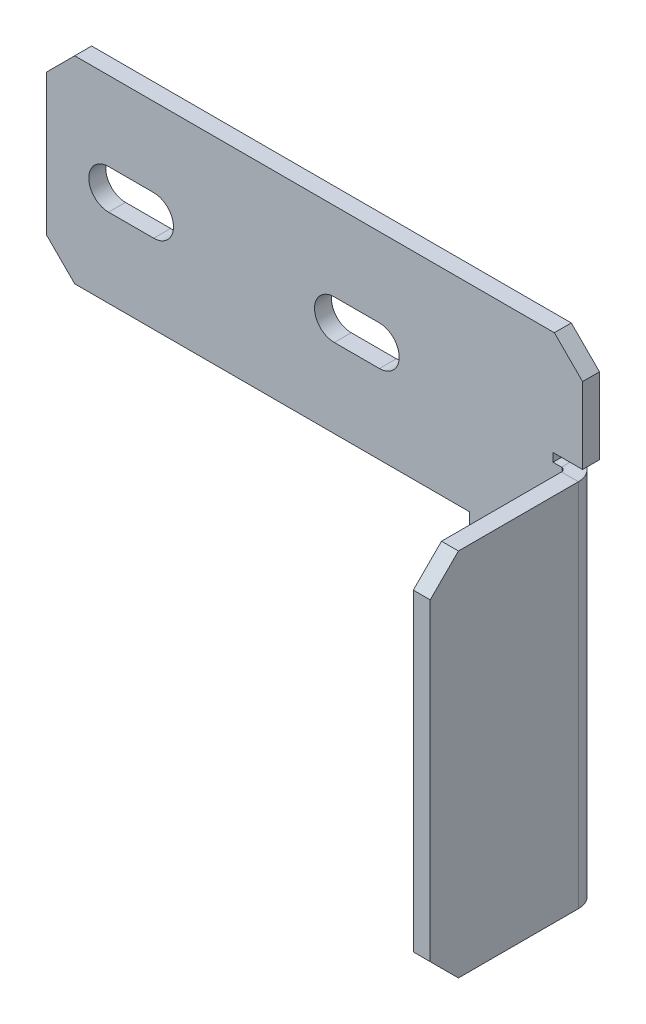
ISO-10303-21;
HEADER;
FILE_DESCRIPTION(('STEP AP214'),'2;1');
FILE_NAME('part.step','',(''),(''),'','','');
FILE_SCHEMA(('AUTOMOTIVE_DESIGN { 1 0 10303 214 1 1 1 1 }'));
ENDSEC;
DATA;
#1=APPLICATION_CONTEXT('core data for automotive mechanical design processes');
#2=APPLICATION_PROTOCOL_DEFINITION('international standard','automotive_design',2000,#1);
#3=PRODUCT_CONTEXT('',#1,'mechanical');
#4=PRODUCT('Part','Part','',(#3));
#5=PRODUCT_RELATED_PRODUCT_CATEGORY('part','',(#4));
#6=PRODUCT_DEFINITION_FORMATION('','',#4);
#7=PRODUCT_DEFINITION_CONTEXT('part definition',#1,'design');
#8=PRODUCT_DEFINITION('design','',#6,#7);
#9=PRODUCT_DEFINITION_SHAPE('','',#8);
#10=(LENGTH_UNIT() NAMED_UNIT(*) SI_UNIT(.MILLI.,.METRE.));
#11=(NAMED_UNIT(*) PLANE_ANGLE_UNIT() SI_UNIT($,.RADIAN.));
#12=(NAMED_UNIT(*) SI_UNIT($,.STERADIAN.) SOLID_ANGLE_UNIT());
#13=UNCERTAINTY_MEASURE_WITH_UNIT(LENGTH_MEASURE(1.E-05),#10,'distance_accuracy_value','');
#14=(GEOMETRIC_REPRESENTATION_CONTEXT(3) GLOBAL_UNCERTAINTY_ASSIGNED_CONTEXT((#13)) GLOBAL_UNIT_ASSIGNED_CONTEXT((#10,
#11,#12)) REPRESENTATION_CONTEXT('',''));
#15=CARTESIAN_POINT('',(0.,0.,0.));
#16=DIRECTION('',(0.,0.,1.));
#17=DIRECTION('',(1.,0.,0.));
#18=AXIS2_PLACEMENT_3D('',#15,#16,#17);
#19=CARTESIAN_POINT('',(95.,-85.5330942891491,-3.));
#20=DIRECTION('',(1.,0.,0.));
#21=DIRECTION('',(0.,0.,-1.));
#22=AXIS2_PLACEMENT_3D('',#19,#20,#21);
#23=PLANE('',#22);
#24=DIRECTION('',(0.,1.,0.));
#25=VECTOR('',#24,1.);
#26=CARTESIAN_POINT('',(95.,-85.5330942891491,-3.));
#27=LINE('',#26,#25);
#28=CARTESIAN_POINT('',(95.,-18.5,-3.));
#29=VERTEX_POINT('',#28);
#30=CARTESIAN_POINT('',(95.,-4.99999999999999,-3.));
#31=VERTEX_POINT('',#30);
#32=EDGE_CURVE('E400',#29,#31,#27,.T.);
#33=ORIENTED_EDGE('',*,*,#32,.T.);
#34=DIRECTION('',(0.,0.,1.));
#35=VECTOR('',#34,1.);
#36=CARTESIAN_POINT('',(95.,-4.99999999999999,-3.));
#37=LINE('',#36,#35);
#38=CARTESIAN_POINT('',(95.,-4.99999999999999,0.));
#39=VERTEX_POINT('',#38);
#40=EDGE_CURVE('E456',#31,#39,#37,.T.);
#41=ORIENTED_EDGE('',*,*,#40,.T.);
#42=DIRECTION('',(0.,1.,0.));
#43=VECTOR('',#42,1.);
#44=CARTESIAN_POINT('',(95.,-85.5330942891491,0.));
#45=LINE('',#44,#43);
#46=CARTESIAN_POINT('',(95.,-18.5,0.));
#47=VERTEX_POINT('',#46);
#48=EDGE_CURVE('E416',#47,#39,#45,.T.);
#49=ORIENTED_EDGE('',*,*,#48,.F.);
#50=DIRECTION('',(0.,0.,-1.));
#51=VECTOR('',#50,1.);
#52=CARTESIAN_POINT('',(95.,-18.5,0.));
#53=LINE('',#52,#51);
#54=EDGE_CURVE('E370',#47,#29,#53,.T.);
#55=ORIENTED_EDGE('',*,*,#54,.T.);
#56=EDGE_LOOP('',(#33,#41,#49,#55));
#57=FACE_BOUND('',#56,.T.);
#58=ADVANCED_FACE('F59',(#57),#23,.T.);
#59=CARTESIAN_POINT('',(0.,0.,-3.));
#60=DIRECTION('',(0.,0.,1.));
#61=DIRECTION('',(1.,0.,0.));
#62=AXIS2_PLACEMENT_3D('',#59,#60,#61);
#63=PLANE('',#62);
#64=DIRECTION('',(-1.,0.,0.));
#65=VECTOR('',#64,1.);
#66=CARTESIAN_POINT('',(0.,-14.,-3.));
#67=LINE('',#66,#65);
#68=CARTESIAN_POINT('',(19.,-14.,-3.));
#69=VERTEX_POINT('',#68);
#70=CARTESIAN_POINT('',(11.,-14.,-3.));
#71=VERTEX_POINT('',#70);
#72=EDGE_CURVE('E308',#69,#71,#67,.T.);
#73=ORIENTED_EDGE('',*,*,#72,.T.);
#74=CARTESIAN_POINT('',(11.,-17.5,-3.));
#75=DIRECTION('',(0.,0.,1.));
#76=DIRECTION('',(1.,0.,0.));
#77=AXIS2_PLACEMENT_3D('',#74,#75,#76);
#78=CIRCLE('',#77,3.50000000000001);
#79=CARTESIAN_POINT('',(11.,-21.,-3.));
#80=VERTEX_POINT('',#79);
#81=EDGE_CURVE('E311',#71,#80,#78,.T.);
#82=ORIENTED_EDGE('',*,*,#81,.T.);
#83=DIRECTION('',(1.,0.,0.));
#84=VECTOR('',#83,1.);
#85=CARTESIAN_POINT('',(0.,-21.,-3.));
#86=LINE('',#85,#84);
#87=CARTESIAN_POINT('',(19.,-21.,-3.));
#88=VERTEX_POINT('',#87);
#89=EDGE_CURVE('E305',#80,#88,#86,.T.);
#90=ORIENTED_EDGE('',*,*,#89,.T.);
#91=CARTESIAN_POINT('',(19.,-17.5,-3.));
#92=DIRECTION('',(0.,0.,1.));
#93=DIRECTION('',(1.,0.,0.));
#94=AXIS2_PLACEMENT_3D('',#91,#92,#93);
#95=CIRCLE('',#94,3.5);
#96=EDGE_CURVE('E249',#88,#69,#95,.T.);
#97=ORIENTED_EDGE('',*,*,#96,.T.);
#98=EDGE_LOOP('',(#73,#82,#90,#97));
#99=FACE_BOUND('',#98,.T.);
#100=DIRECTION('',(-1.,0.,0.));
#101=VECTOR('',#100,1.);
#102=CARTESIAN_POINT('',(0.,-14.,-3.));
#103=LINE('',#102,#101);
#104=CARTESIAN_POINT('',(59.,-14.,-3.));
#105=VERTEX_POINT('',#104);
#106=CARTESIAN_POINT('',(51.,-14.,-3.));
#107=VERTEX_POINT('',#106);
#108=EDGE_CURVE('E299',#105,#107,#103,.T.);
#109=ORIENTED_EDGE('',*,*,#108,.T.);
#110=CARTESIAN_POINT('',(51.,-17.5,-3.));
#111=DIRECTION('',(0.,0.,1.));
#112=DIRECTION('',(1.,0.,0.));
#113=AXIS2_PLACEMENT_3D('',#110,#111,#112);
#114=CIRCLE('',#113,3.5);
#115=CARTESIAN_POINT('',(51.,-21.,-3.));
#116=VERTEX_POINT('',#115);
#117=EDGE_CURVE('E302',#107,#116,#114,.T.);
#118=ORIENTED_EDGE('',*,*,#117,.T.);
#119=DIRECTION('',(1.,0.,0.));
#120=VECTOR('',#119,1.);
#121=CARTESIAN_POINT('',(0.,-21.,-3.));
#122=LINE('',#121,#120);
#123=CARTESIAN_POINT('',(59.,-21.,-3.));
#124=VERTEX_POINT('',#123);
#125=EDGE_CURVE('E273',#116,#124,#122,.T.);
#126=ORIENTED_EDGE('',*,*,#125,.T.);
#127=CARTESIAN_POINT('',(59.,-17.5,-3.));
#128=DIRECTION('',(0.,0.,1.));
#129=DIRECTION('',(1.,0.,0.));
#130=AXIS2_PLACEMENT_3D('',#127,#128,#129);
#131=CIRCLE('',#130,3.5);
#132=EDGE_CURVE('E296',#124,#105,#131,.T.);
#133=ORIENTED_EDGE('',*,*,#132,.T.);
#134=EDGE_LOOP('',(#109,#118,#126,#133));
#135=FACE_BOUND('',#134,.T.);
#136=DIRECTION('',(1.,0.,0.));
#137=VECTOR('',#136,1.);
#138=CARTESIAN_POINT('',(75.,-85.5330942891491,-3.));
#139=LINE('',#138,#137);
#140=CARTESIAN_POINT('',(80.,-85.5330942891491,-3.));
#141=VERTEX_POINT('',#140);
#142=CARTESIAN_POINT('',(91.2634,-85.5330942891491,-3.));
#143=VERTEX_POINT('',#142);
#144=EDGE_CURVE('E398',#141,#143,#139,.T.);
#145=ORIENTED_EDGE('',*,*,#144,.F.);
#146=DIRECTION('',(0.70710678118655,-0.707106781186546,0.));
#147=VECTOR('',#146,1.);
#148=CARTESIAN_POINT('',(75.,-80.5330942891491,-3.));
#149=LINE('',#148,#147);
#150=CARTESIAN_POINT('',(75.,-80.5330942891491,-3.));
#151=VERTEX_POINT('',#150);
#152=EDGE_CURVE('E442',#141,#151,#149,.F.);
#153=ORIENTED_EDGE('',*,*,#152,.T.);
#154=DIRECTION('',(0.,-1.,0.));
#155=VECTOR('',#154,1.);
#156=CARTESIAN_POINT('',(75.,-35.,-3.));
#157=LINE('',#156,#155);
#158=CARTESIAN_POINT('',(75.,-35.,-3.));
#159=VERTEX_POINT('',#158);
#160=EDGE_CURVE('E395',#159,#151,#157,.T.);
#161=ORIENTED_EDGE('',*,*,#160,.F.);
#162=DIRECTION('',(1.,0.,0.));
#163=VECTOR('',#162,1.);
#164=CARTESIAN_POINT('',(0.,-35.,-3.));
#165=LINE('',#164,#163);
#166=CARTESIAN_POINT('',(5.00000000000006,-35.,-3.));
#167=VERTEX_POINT('',#166);
#168=EDGE_CURVE('E392',#167,#159,#165,.T.);
#169=ORIENTED_EDGE('',*,*,#168,.F.);
#170=DIRECTION('',(0.707106781186549,-0.707106781186546,0.));
#171=VECTOR('',#170,1.);
#172=CARTESIAN_POINT('',(0.,-30.,-3.));
#173=LINE('',#172,#171);
#174=CARTESIAN_POINT('',(0.,-30.,-3.));
#175=VERTEX_POINT('',#174);
#176=EDGE_CURVE('E440',#167,#175,#173,.F.);
#177=ORIENTED_EDGE('',*,*,#176,.T.);
#178=DIRECTION('',(0.,-1.,0.));
#179=VECTOR('',#178,1.);
#180=CARTESIAN_POINT('',(0.,0.,-3.));
#181=LINE('',#180,#179);
#182=CARTESIAN_POINT('',(0.,-5.,-3.));
#183=VERTEX_POINT('',#182);
#184=EDGE_CURVE('E389',#183,#175,#181,.T.);
#185=ORIENTED_EDGE('',*,*,#184,.F.);
#186=DIRECTION('',(-0.707106781186547,-0.707106781186549,0.));
#187=VECTOR('',#186,1.);
#188=CARTESIAN_POINT('',(4.99999999999999,0.,-3.));
#189=LINE('',#188,#187);
#190=CARTESIAN_POINT('',(4.99999999999999,0.,-3.));
#191=VERTEX_POINT('',#190);
#192=EDGE_CURVE('E438',#183,#191,#189,.F.);
#193=ORIENTED_EDGE('',*,*,#192,.T.);
#194=DIRECTION('',(-1.,0.,0.));
#195=VECTOR('',#194,1.);
#196=CARTESIAN_POINT('',(0.,0.,-3.));
#197=LINE('',#196,#195);
#198=CARTESIAN_POINT('',(90.,0.,-3.));
#199=VERTEX_POINT('',#198);
#200=EDGE_CURVE('E403',#199,#191,#197,.T.);
#201=ORIENTED_EDGE('',*,*,#200,.F.);
#202=DIRECTION('',(-0.707106781186549,0.707106781186547,0.));
#203=VECTOR('',#202,1.);
#204=CARTESIAN_POINT('',(95.,-4.99999999999999,-3.));
#205=LINE('',#204,#203);
#206=EDGE_CURVE('E436',#199,#31,#205,.F.);
#207=ORIENTED_EDGE('',*,*,#206,.T.);
#208=ORIENTED_EDGE('',*,*,#32,.F.);
#209=DIRECTION('',(1.,0.,0.));
#210=VECTOR('',#209,1.);
#211=CARTESIAN_POINT('',(0.,-18.5,-3.));
#212=LINE('',#211,#210);
#213=CARTESIAN_POINT('',(89.7634,-18.5,-3.));
#214=VERTEX_POINT('',#213);
#215=EDGE_CURVE('E386',#214,#29,#212,.T.);
#216=ORIENTED_EDGE('',*,*,#215,.F.);
#217=DIRECTION('',(0.,1.,0.));
#218=VECTOR('',#217,1.);
#219=CARTESIAN_POINT('',(89.7634,0.,-3.));
#220=LINE('',#219,#218);
#221=CARTESIAN_POINT('',(89.7634,-20.,-3.));
#222=VERTEX_POINT('',#221);
#223=EDGE_CURVE('E384',#222,#214,#220,.T.);
#224=ORIENTED_EDGE('',*,*,#223,.F.);
#225=DIRECTION('',(-1.,0.,0.));
#226=VECTOR('',#225,1.);
#227=CARTESIAN_POINT('',(0.,-20.,-3.));
#228=LINE('',#227,#226);
#229=CARTESIAN_POINT('',(91.2634,-20.,-3.));
#230=VERTEX_POINT('',#229);
#231=EDGE_CURVE('E369',#230,#222,#228,.T.);
#232=ORIENTED_EDGE('',*,*,#231,.F.);
#233=DIRECTION('',(0.,1.,0.));
#234=VECTOR('',#233,1.);
#235=CARTESIAN_POINT('',(91.2634,-20.,-3.));
#236=LINE('',#235,#234);
#237=EDGE_CURVE('E342',#230,#143,#236,.F.);
#238=ORIENTED_EDGE('',*,*,#237,.T.);
#239=EDGE_LOOP('',(#145,#153,#161,#169,#177,#185,#193,#201,#207,#208,#216,#224,#232,#238));
#240=FACE_BOUND('',#239,.T.);
#241=ADVANCED_FACE('F527',(#99,#135,#240),#63,.F.);
#242=CARTESIAN_POINT('',(0.,0.,0.));
#243=DIRECTION('',(0.,0.,1.));
#244=DIRECTION('',(1.,0.,0.));
#245=AXIS2_PLACEMENT_3D('',#242,#243,#244);
#246=PLANE('',#245);
#247=CARTESIAN_POINT('',(11.,-17.5,0.));
#248=DIRECTION('',(0.,0.,1.));
#249=DIRECTION('',(1.,0.,0.));
#250=AXIS2_PLACEMENT_3D('',#247,#248,#249);
#251=CIRCLE('',#250,3.50000000000001);
#252=CARTESIAN_POINT('',(11.,-14.,0.));
#253=VERTEX_POINT('',#252);
#254=CARTESIAN_POINT('',(11.,-21.,0.));
#255=VERTEX_POINT('',#254);
#256=EDGE_CURVE('E261',#253,#255,#251,.T.);
#257=ORIENTED_EDGE('',*,*,#256,.F.);
#258=DIRECTION('',(-1.,0.,0.));
#259=VECTOR('',#258,1.);
#260=CARTESIAN_POINT('',(11.,-14.,0.));
#261=LINE('',#260,#259);
#262=CARTESIAN_POINT('',(19.,-14.,0.));
#263=VERTEX_POINT('',#262);
#264=EDGE_CURVE('E266',#263,#253,#261,.T.);
#265=ORIENTED_EDGE('',*,*,#264,.F.);
#266=CARTESIAN_POINT('',(19.,-17.5,0.));
#267=DIRECTION('',(0.,0.,1.));
#268=DIRECTION('',(1.,0.,0.));
#269=AXIS2_PLACEMENT_3D('',#266,#267,#268);
#270=CIRCLE('',#269,3.5);
#271=CARTESIAN_POINT('',(19.,-21.,0.));
#272=VERTEX_POINT('',#271);
#273=EDGE_CURVE('E246',#272,#263,#270,.T.);
#274=ORIENTED_EDGE('',*,*,#273,.F.);
#275=DIRECTION('',(1.,0.,0.));
#276=VECTOR('',#275,1.);
#277=CARTESIAN_POINT('',(11.,-21.,0.));
#278=LINE('',#277,#276);
#279=EDGE_CURVE('E256',#255,#272,#278,.T.);
#280=ORIENTED_EDGE('',*,*,#279,.F.);
#281=EDGE_LOOP('',(#257,#265,#274,#280));
#282=FACE_BOUND('',#281,.T.);
#283=CARTESIAN_POINT('',(51.,-17.5,0.));
#284=DIRECTION('',(0.,0.,1.));
#285=DIRECTION('',(1.,0.,0.));
#286=AXIS2_PLACEMENT_3D('',#283,#284,#285);
#287=CIRCLE('',#286,3.5);
#288=CARTESIAN_POINT('',(51.,-14.,0.));
#289=VERTEX_POINT('',#288);
#290=CARTESIAN_POINT('',(51.,-21.,0.));
#291=VERTEX_POINT('',#290);
#292=EDGE_CURVE('E276',#289,#291,#287,.T.);
#293=ORIENTED_EDGE('',*,*,#292,.F.);
#294=DIRECTION('',(-1.,0.,0.));
#295=VECTOR('',#294,1.);
#296=CARTESIAN_POINT('',(51.,-14.,0.));
#297=LINE('',#296,#295);
#298=CARTESIAN_POINT('',(59.,-14.,0.));
#299=VERTEX_POINT('',#298);
#300=EDGE_CURVE('E283',#299,#289,#297,.T.);
#301=ORIENTED_EDGE('',*,*,#300,.F.);
#302=CARTESIAN_POINT('',(59.,-17.5,0.));
#303=DIRECTION('',(0.,0.,1.));
#304=DIRECTION('',(1.,0.,0.));
#305=AXIS2_PLACEMENT_3D('',#302,#303,#304);
#306=CIRCLE('',#305,3.5);
#307=CARTESIAN_POINT('',(59.,-21.,0.));
#308=VERTEX_POINT('',#307);
#309=EDGE_CURVE('E280',#308,#299,#306,.T.);
#310=ORIENTED_EDGE('',*,*,#309,.F.);
#311=DIRECTION('',(1.,0.,0.));
#312=VECTOR('',#311,1.);
#313=CARTESIAN_POINT('',(51.,-21.,0.));
#314=LINE('',#313,#312);
#315=EDGE_CURVE('E278',#291,#308,#314,.T.);
#316=ORIENTED_EDGE('',*,*,#315,.F.);
#317=EDGE_LOOP('',(#293,#301,#310,#316));
#318=FACE_BOUND('',#317,.T.);
#319=DIRECTION('',(0.,-1.,0.));
#320=VECTOR('',#319,1.);
#321=CARTESIAN_POINT('',(75.,-35.,0.));
#322=LINE('',#321,#320);
#323=CARTESIAN_POINT('',(75.,-35.,0.));
#324=VERTEX_POINT('',#323);
#325=CARTESIAN_POINT('',(75.,-80.5330942891491,0.));
#326=VERTEX_POINT('',#325);
#327=EDGE_CURVE('E411',#324,#326,#322,.T.);
#328=ORIENTED_EDGE('',*,*,#327,.T.);
#329=DIRECTION('',(-0.70710678118655,0.707106781186546,0.));
#330=VECTOR('',#329,1.);
#331=CARTESIAN_POINT('',(-2.76654714457476,-2.76654714457478,0.));
#332=LINE('',#331,#330);
#333=CARTESIAN_POINT('',(80.,-85.5330942891491,0.));
#334=VERTEX_POINT('',#333);
#335=EDGE_CURVE('E432',#326,#334,#332,.F.);
#336=ORIENTED_EDGE('',*,*,#335,.T.);
#337=DIRECTION('',(1.,0.,0.));
#338=VECTOR('',#337,1.);
#339=CARTESIAN_POINT('',(75.,-85.5330942891491,0.));
#340=LINE('',#339,#338);
#341=CARTESIAN_POINT('',(91.2634,-85.5330942891491,0.));
#342=VERTEX_POINT('',#341);
#343=EDGE_CURVE('E414',#334,#342,#340,.T.);
#344=ORIENTED_EDGE('',*,*,#343,.T.);
#345=DIRECTION('',(0.,1.,0.));
#346=VECTOR('',#345,1.);
#347=CARTESIAN_POINT('',(91.2634,-20.,0.));
#348=LINE('',#347,#346);
#349=CARTESIAN_POINT('',(91.2634,-20.,0.));
#350=VERTEX_POINT('',#349);
#351=EDGE_CURVE('E355',#350,#342,#348,.F.);
#352=ORIENTED_EDGE('',*,*,#351,.F.);
#353=DIRECTION('',(1.,0.,0.));
#354=VECTOR('',#353,1.);
#355=CARTESIAN_POINT('',(89.7634,-20.,0.));
#356=LINE('',#355,#354);
#357=CARTESIAN_POINT('',(89.7634,-20.,0.));
#358=VERTEX_POINT('',#357);
#359=EDGE_CURVE('E375',#358,#350,#356,.T.);
#360=ORIENTED_EDGE('',*,*,#359,.F.);
#361=DIRECTION('',(0.,-1.,0.));
#362=VECTOR('',#361,1.);
#363=CARTESIAN_POINT('',(89.7634,-18.5,0.));
#364=LINE('',#363,#362);
#365=CARTESIAN_POINT('',(89.7634,-18.5,0.));
#366=VERTEX_POINT('',#365);
#367=EDGE_CURVE('E371',#366,#358,#364,.T.);
#368=ORIENTED_EDGE('',*,*,#367,.F.);
#369=DIRECTION('',(-1.,0.,0.));
#370=VECTOR('',#369,1.);
#371=CARTESIAN_POINT('',(95.,-18.5,0.));
#372=LINE('',#371,#370);
#373=EDGE_CURVE('E366',#47,#366,#372,.T.);
#374=ORIENTED_EDGE('',*,*,#373,.F.);
#375=ORIENTED_EDGE('',*,*,#48,.T.);
#376=DIRECTION('',(0.707106781186549,-0.707106781186547,0.));
#377=VECTOR('',#376,1.);
#378=CARTESIAN_POINT('',(44.9999999999999,45.,0.));
#379=LINE('',#378,#377);
#380=CARTESIAN_POINT('',(90.,0.,0.));
#381=VERTEX_POINT('',#380);
#382=EDGE_CURVE('E426',#39,#381,#379,.F.);
#383=ORIENTED_EDGE('',*,*,#382,.T.);
#384=DIRECTION('',(-1.,0.,0.));
#385=VECTOR('',#384,1.);
#386=CARTESIAN_POINT('',(0.,0.,0.));
#387=LINE('',#386,#385);
#388=CARTESIAN_POINT('',(4.99999999999999,0.,0.));
#389=VERTEX_POINT('',#388);
#390=EDGE_CURVE('E393',#381,#389,#387,.T.);
#391=ORIENTED_EDGE('',*,*,#390,.T.);
#392=DIRECTION('',(0.707106781186547,0.707106781186549,0.));
#393=VECTOR('',#392,1.);
#394=CARTESIAN_POINT('',(2.5,-2.5,0.));
#395=LINE('',#394,#393);
#396=CARTESIAN_POINT('',(0.,-5.,0.));
#397=VERTEX_POINT('',#396);
#398=EDGE_CURVE('E428',#389,#397,#395,.F.);
#399=ORIENTED_EDGE('',*,*,#398,.T.);
#400=DIRECTION('',(0.,-1.,0.));
#401=VECTOR('',#400,1.);
#402=CARTESIAN_POINT('',(0.,0.,0.));
#403=LINE('',#402,#401);
#404=CARTESIAN_POINT('',(0.,-30.,0.));
#405=VERTEX_POINT('',#404);
#406=EDGE_CURVE('E388',#397,#405,#403,.T.);
#407=ORIENTED_EDGE('',*,*,#406,.T.);
#408=DIRECTION('',(-0.707106781186549,0.707106781186546,0.));
#409=VECTOR('',#408,1.);
#410=CARTESIAN_POINT('',(-15.,-15.0000000000001,0.));
#411=LINE('',#410,#409);
#412=CARTESIAN_POINT('',(5.00000000000006,-35.,0.));
#413=VERTEX_POINT('',#412);
#414=EDGE_CURVE('E430',#405,#413,#411,.F.);
#415=ORIENTED_EDGE('',*,*,#414,.T.);
#416=DIRECTION('',(1.,0.,0.));
#417=VECTOR('',#416,1.);
#418=CARTESIAN_POINT('',(0.,-35.,0.));
#419=LINE('',#418,#417);
#420=EDGE_CURVE('E409',#413,#324,#419,.T.);
#421=ORIENTED_EDGE('',*,*,#420,.T.);
#422=EDGE_LOOP('',(#328,#336,#344,#352,#360,#368,#374,#375,#383,#391,#399,#407,#415,#421));
#423=FACE_BOUND('',#422,.T.);
#424=ADVANCED_FACE('F263',(#282,#318,#423),#246,.T.);
#425=CARTESIAN_POINT('',(0.,0.,-3.));
#426=DIRECTION('',(-1.,0.,0.));
#427=DIRECTION('',(0.,0.,1.));
#428=AXIS2_PLACEMENT_3D('',#425,#426,#427);
#429=PLANE('',#428);
#430=ORIENTED_EDGE('',*,*,#184,.T.);
#431=DIRECTION('',(0.,0.,1.));
#432=VECTOR('',#431,1.);
#433=CARTESIAN_POINT('',(0.,-30.,-3.));
#434=LINE('',#433,#432);
#435=EDGE_CURVE('E446',#175,#405,#434,.T.);
#436=ORIENTED_EDGE('',*,*,#435,.T.);
#437=ORIENTED_EDGE('',*,*,#406,.F.);
#438=DIRECTION('',(0.,0.,-1.));
#439=VECTOR('',#438,1.);
#440=CARTESIAN_POINT('',(0.,-5.,-3.));
#441=LINE('',#440,#439);
#442=EDGE_CURVE('E444',#397,#183,#441,.T.);
#443=ORIENTED_EDGE('',*,*,#442,.T.);
#444=EDGE_LOOP('',(#430,#436,#437,#443));
#445=FACE_BOUND('',#444,.T.);
#446=ADVANCED_FACE('F555',(#445),#429,.T.);
#447=CARTESIAN_POINT('',(0.,0.,-3.));
#448=DIRECTION('',(0.,1.,0.));
#449=DIRECTION('',(0.,0.,1.));
#450=AXIS2_PLACEMENT_3D('',#447,#448,#449);
#451=PLANE('',#450);
#452=ORIENTED_EDGE('',*,*,#200,.T.);
#453=DIRECTION('',(0.,0.,1.));
#454=VECTOR('',#453,1.);
#455=CARTESIAN_POINT('',(4.99999999999999,0.,-3.));
#456=LINE('',#455,#454);
#457=EDGE_CURVE('E453',#191,#389,#456,.T.);
#458=ORIENTED_EDGE('',*,*,#457,.T.);
#459=ORIENTED_EDGE('',*,*,#390,.F.);
#460=DIRECTION('',(0.,0.,-1.));
#461=VECTOR('',#460,1.);
#462=CARTESIAN_POINT('',(90.,0.,-3.));
#463=LINE('',#462,#461);
#464=EDGE_CURVE('E451',#381,#199,#463,.T.);
#465=ORIENTED_EDGE('',*,*,#464,.T.);
#466=EDGE_LOOP('',(#452,#458,#459,#465));
#467=FACE_BOUND('',#466,.T.);
#468=ADVANCED_FACE('F546',(#467),#451,.T.);
#469=CARTESIAN_POINT('',(75.,-85.5330942891491,-3.));
#470=DIRECTION('',(0.,-1.,0.));
#471=DIRECTION('',(0.,0.,-1.));
#472=AXIS2_PLACEMENT_3D('',#469,#470,#471);
#473=PLANE('',#472);
#474=ORIENTED_EDGE('',*,*,#343,.F.);
#475=DIRECTION('',(0.,0.,-1.));
#476=VECTOR('',#475,1.);
#477=CARTESIAN_POINT('',(80.,-85.5330942891491,-3.));
#478=LINE('',#477,#476);
#479=EDGE_CURVE('E434',#334,#141,#478,.T.);
#480=ORIENTED_EDGE('',*,*,#479,.T.);
#481=ORIENTED_EDGE('',*,*,#144,.T.);
#482=DIRECTION('',(0.,0.,-1.));
#483=VECTOR('',#482,1.);
#484=CARTESIAN_POINT('',(91.2634,-85.5330942891491,0.));
#485=LINE('',#484,#483);
#486=EDGE_CURVE('E360',#342,#143,#485,.T.);
#487=ORIENTED_EDGE('',*,*,#486,.F.);
#488=EDGE_LOOP('',(#474,#480,#481,#487));
#489=FACE_BOUND('',#488,.T.);
#490=ADVANCED_FACE('F515',(#489),#473,.T.);
#491=CARTESIAN_POINT('',(75.,-35.,-3.));
#492=DIRECTION('',(-1.,0.,0.));
#493=DIRECTION('',(0.,-1.,0.));
#494=AXIS2_PLACEMENT_3D('',#491,#492,#493);
#495=PLANE('',#494);
#496=ORIENTED_EDGE('',*,*,#160,.T.);
#497=DIRECTION('',(0.,0.,1.));
#498=VECTOR('',#497,1.);
#499=CARTESIAN_POINT('',(75.,-80.5330942891491,-3.));
#500=LINE('',#499,#498);
#501=EDGE_CURVE('E423',#151,#326,#500,.T.);
#502=ORIENTED_EDGE('',*,*,#501,.T.);
#503=ORIENTED_EDGE('',*,*,#327,.F.);
#504=DIRECTION('',(0.,0.,1.));
#505=VECTOR('',#504,1.);
#506=CARTESIAN_POINT('',(75.,-35.,-3.));
#507=LINE('',#506,#505);
#508=EDGE_CURVE('E406',#159,#324,#507,.T.);
#509=ORIENTED_EDGE('',*,*,#508,.F.);
#510=EDGE_LOOP('',(#496,#502,#503,#509));
#511=FACE_BOUND('',#510,.T.);
#512=ADVANCED_FACE('F570',(#511),#495,.T.);
#513=CARTESIAN_POINT('',(0.,-35.,-3.));
#514=DIRECTION('',(0.,-1.,0.));
#515=DIRECTION('',(0.,0.,-1.));
#516=AXIS2_PLACEMENT_3D('',#513,#514,#515);
#517=PLANE('',#516);
#518=ORIENTED_EDGE('',*,*,#420,.F.);
#519=DIRECTION('',(0.,0.,-1.));
#520=VECTOR('',#519,1.);
#521=CARTESIAN_POINT('',(5.00000000000006,-35.,-3.));
#522=LINE('',#521,#520);
#523=EDGE_CURVE('E449',#413,#167,#522,.T.);
#524=ORIENTED_EDGE('',*,*,#523,.T.);
#525=ORIENTED_EDGE('',*,*,#168,.T.);
#526=ORIENTED_EDGE('',*,*,#508,.T.);
#527=EDGE_LOOP('',(#518,#524,#525,#526));
#528=FACE_BOUND('',#527,.T.);
#529=ADVANCED_FACE('F564',(#528),#517,.T.);
#530=CARTESIAN_POINT('',(95.,-18.5,0.));
#531=DIRECTION('',(0.,-1.,0.));
#532=DIRECTION('',(0.,0.,-1.));
#533=AXIS2_PLACEMENT_3D('',#530,#531,#532);
#534=PLANE('',#533);
#535=DIRECTION('',(0.,0.,-1.));
#536=VECTOR('',#535,1.);
#537=CARTESIAN_POINT('',(89.7634,-18.5,0.));
#538=LINE('',#537,#536);
#539=EDGE_CURVE('E374',#366,#214,#538,.T.);
#540=ORIENTED_EDGE('',*,*,#539,.T.);
#541=ORIENTED_EDGE('',*,*,#215,.T.);
#542=ORIENTED_EDGE('',*,*,#54,.F.);
#543=ORIENTED_EDGE('',*,*,#373,.T.);
#544=EDGE_LOOP('',(#540,#541,#542,#543));
#545=FACE_BOUND('',#544,.T.);
#546=ADVANCED_FACE('F535',(#545),#534,.T.);
#547=CARTESIAN_POINT('',(89.7634,-18.5,0.));
#548=DIRECTION('',(1.,0.,0.));
#549=DIRECTION('',(0.,0.,-1.));
#550=AXIS2_PLACEMENT_3D('',#547,#548,#549);
#551=PLANE('',#550);
#552=DIRECTION('',(0.,0.,-1.));
#553=VECTOR('',#552,1.);
#554=CARTESIAN_POINT('',(89.7634,-20.,0.));
#555=LINE('',#554,#553);
#556=EDGE_CURVE('E363',#358,#222,#555,.T.);
#557=ORIENTED_EDGE('',*,*,#556,.T.);
#558=ORIENTED_EDGE('',*,*,#223,.T.);
#559=ORIENTED_EDGE('',*,*,#539,.F.);
#560=ORIENTED_EDGE('',*,*,#367,.T.);
#561=EDGE_LOOP('',(#557,#558,#559,#560));
#562=FACE_BOUND('',#561,.T.);
#563=ADVANCED_FACE('F533',(#562),#551,.T.);
#564=CARTESIAN_POINT('',(89.7634,-20.,0.));
#565=DIRECTION('',(0.,1.,0.));
#566=DIRECTION('',(0.,0.,1.));
#567=AXIS2_PLACEMENT_3D('',#564,#565,#566);
#568=PLANE('',#567);
#569=DIRECTION('',(0.,0.,-1.));
#570=VECTOR('',#569,1.);
#571=CARTESIAN_POINT('',(91.2634,-20.,0.));
#572=LINE('',#571,#570);
#573=EDGE_CURVE('E349',#350,#230,#572,.T.);
#574=ORIENTED_EDGE('',*,*,#573,.T.);
#575=ORIENTED_EDGE('',*,*,#231,.T.);
#576=ORIENTED_EDGE('',*,*,#556,.F.);
#577=ORIENTED_EDGE('',*,*,#359,.T.);
#578=EDGE_LOOP('',(#574,#575,#576,#577));
#579=FACE_BOUND('',#578,.T.);
#580=ADVANCED_FACE('F525',(#579),#568,.T.);
#581=CARTESIAN_POINT('',(91.2634,-85.5330942891491,0.736600000000006));
#582=DIRECTION('',(0.,-1.,0.));
#583=DIRECTION('',(0.,0.,-1.));
#584=AXIS2_PLACEMENT_3D('',#581,#582,#583);
#585=PLANE('',#584);
#586=DIRECTION('',(-1.,0.,0.));
#587=VECTOR('',#586,1.);
#588=CARTESIAN_POINT('',(95.,-85.5330942891491,0.736599999999993));
#589=LINE('',#588,#587);
#590=CARTESIAN_POINT('',(92.,-85.5330942891491,0.736600000000004));
#591=VERTEX_POINT('',#590);
#592=CARTESIAN_POINT('',(95.,-85.5330942891491,0.736599999999993));
#593=VERTEX_POINT('',#592);
#594=EDGE_CURVE('E314',#591,#593,#589,.F.);
#595=ORIENTED_EDGE('',*,*,#594,.F.);
#596=CARTESIAN_POINT('',(91.2634,-85.5330942891491,0.736600000000006));
#597=DIRECTION('',(0.,1.,0.));
#598=DIRECTION('',(0.,0.,1.));
#599=AXIS2_PLACEMENT_3D('',#596,#597,#598);
#600=CIRCLE('',#599,0.736600000000004);
#601=EDGE_CURVE('E352',#342,#591,#600,.F.);
#602=ORIENTED_EDGE('',*,*,#601,.F.);
#603=ORIENTED_EDGE('',*,*,#486,.T.);
#604=CARTESIAN_POINT('',(91.2634,-85.5330942891491,0.736600000000006));
#605=DIRECTION('',(0.,1.,0.));
#606=DIRECTION('',(0.,0.,1.));
#607=AXIS2_PLACEMENT_3D('',#604,#605,#606);
#608=CIRCLE('',#607,3.7366);
#609=EDGE_CURVE('E345',#143,#593,#608,.F.);
#610=ORIENTED_EDGE('',*,*,#609,.T.);
#611=EDGE_LOOP('',(#595,#602,#603,#610));
#612=FACE_BOUND('',#611,.T.);
#613=ADVANCED_FACE('F510',(#612),#585,.T.);
#614=CARTESIAN_POINT('',(91.2634,-20.,0.736600000000006));
#615=DIRECTION('',(0.,-1.,0.));
#616=DIRECTION('',(0.,0.,-1.));
#617=AXIS2_PLACEMENT_3D('',#614,#615,#616);
#618=PLANE('',#617);
#619=CARTESIAN_POINT('',(91.2634,-20.,0.736600000000006));
#620=DIRECTION('',(0.,1.,0.));
#621=DIRECTION('',(0.,0.,1.));
#622=AXIS2_PLACEMENT_3D('',#619,#620,#621);
#623=CIRCLE('',#622,0.736600000000004);
#624=CARTESIAN_POINT('',(92.,-20.,0.736600000000004));
#625=VERTEX_POINT('',#624);
#626=EDGE_CURVE('E318',#625,#350,#623,.T.);
#627=ORIENTED_EDGE('',*,*,#626,.F.);
#628=DIRECTION('',(-1.,0.,0.));
#629=VECTOR('',#628,1.);
#630=CARTESIAN_POINT('',(92.,-20.,0.736600000000004));
#631=LINE('',#630,#629);
#632=CARTESIAN_POINT('',(95.,-20.,0.736599999999993));
#633=VERTEX_POINT('',#632);
#634=EDGE_CURVE('E335',#625,#633,#631,.F.);
#635=ORIENTED_EDGE('',*,*,#634,.T.);
#636=CARTESIAN_POINT('',(91.2634,-20.,0.736600000000006));
#637=DIRECTION('',(0.,1.,0.));
#638=DIRECTION('',(0.,0.,1.));
#639=AXIS2_PLACEMENT_3D('',#636,#637,#638);
#640=CIRCLE('',#639,3.7366);
#641=EDGE_CURVE('E346',#633,#230,#640,.T.);
#642=ORIENTED_EDGE('',*,*,#641,.T.);
#643=ORIENTED_EDGE('',*,*,#573,.F.);
#644=EDGE_LOOP('',(#627,#635,#642,#643));
#645=FACE_BOUND('',#644,.T.);
#646=ADVANCED_FACE('F503',(#645),#618,.F.);
#647=CARTESIAN_POINT('',(91.2634,-20.,0.736600000000006));
#648=DIRECTION('',(0.,1.,0.));
#649=DIRECTION('',(1.,0.,0.));
#650=AXIS2_PLACEMENT_3D('',#647,#648,#649);
#651=CYLINDRICAL_SURFACE('',#650,3.7366);
#652=ORIENTED_EDGE('',*,*,#237,.F.);
#653=ORIENTED_EDGE('',*,*,#641,.F.);
#654=DIRECTION('',(0.,1.,0.));
#655=VECTOR('',#654,1.);
#656=CARTESIAN_POINT('',(95.,-85.5330942891491,0.736599999999993));
#657=LINE('',#656,#655);
#658=EDGE_CURVE('E332',#633,#593,#657,.F.);
#659=ORIENTED_EDGE('',*,*,#658,.T.);
#660=ORIENTED_EDGE('',*,*,#609,.F.);
#661=EDGE_LOOP('',(#652,#653,#659,#660));
#662=FACE_BOUND('',#661,.T.);
#663=ADVANCED_FACE('F508',(#662),#651,.T.);
#664=CARTESIAN_POINT('',(91.2634,-20.,0.736600000000006));
#665=DIRECTION('',(0.,1.,0.));
#666=DIRECTION('',(1.,0.,0.));
#667=AXIS2_PLACEMENT_3D('',#664,#665,#666);
#668=CYLINDRICAL_SURFACE('',#667,0.736600000000004);
#669=ORIENTED_EDGE('',*,*,#351,.T.);
#670=ORIENTED_EDGE('',*,*,#601,.T.);
#671=DIRECTION('',(0.,1.,0.));
#672=VECTOR('',#671,1.);
#673=CARTESIAN_POINT('',(92.,-85.5330942891491,0.736600000000004));
#674=LINE('',#673,#672);
#675=EDGE_CURVE('E338',#591,#625,#674,.T.);
#676=ORIENTED_EDGE('',*,*,#675,.T.);
#677=ORIENTED_EDGE('',*,*,#626,.T.);
#678=EDGE_LOOP('',(#669,#670,#676,#677));
#679=FACE_BOUND('',#678,.T.);
#680=ADVANCED_FACE('F520',(#679),#668,.F.);
#681=CARTESIAN_POINT('',(95.,-85.5330942891491,0.));
#682=DIRECTION('',(0.,1.,0.));
#683=DIRECTION('',(0.,0.,1.));
#684=AXIS2_PLACEMENT_3D('',#681,#682,#683);
#685=PLANE('',#684);
#686=DIRECTION('',(0.,0.,-1.));
#687=VECTOR('',#686,1.);
#688=CARTESIAN_POINT('',(95.,-85.5330942891491,-3.52279217801589E-13));
#689=LINE('',#688,#687);
#690=CARTESIAN_POINT('',(95.0000000000001,-85.5330942891491,22.));
#691=VERTEX_POINT('',#690);
#692=EDGE_CURVE('E322',#691,#593,#689,.T.);
#693=ORIENTED_EDGE('',*,*,#692,.F.);
#694=DIRECTION('',(-1.,0.,0.));
#695=VECTOR('',#694,1.);
#696=CARTESIAN_POINT('',(95.0000000000001,-85.5330942891491,22.));
#697=LINE('',#696,#695);
#698=CARTESIAN_POINT('',(92.0000000000001,-85.5330942891491,22.));
#699=VERTEX_POINT('',#698);
#700=EDGE_CURVE('E459',#691,#699,#697,.T.);
#701=ORIENTED_EDGE('',*,*,#700,.T.);
#702=DIRECTION('',(0.,0.,1.));
#703=VECTOR('',#702,1.);
#704=CARTESIAN_POINT('',(92.,-85.5330942891491,0.));
#705=LINE('',#704,#703);
#706=EDGE_CURVE('E330',#699,#591,#705,.F.);
#707=ORIENTED_EDGE('',*,*,#706,.T.);
#708=ORIENTED_EDGE('',*,*,#594,.T.);
#709=EDGE_LOOP('',(#693,#701,#707,#708));
#710=FACE_BOUND('',#709,.T.);
#711=ADVANCED_FACE('F482',(#710),#685,.F.);
#712=CARTESIAN_POINT('',(95.0000000000001,-20.,27.));
#713=DIRECTION('',(0.,-1.,0.));
#714=DIRECTION('',(0.,0.,-1.));
#715=AXIS2_PLACEMENT_3D('',#712,#713,#714);
#716=PLANE('',#715);
#717=DIRECTION('',(0.,0.,-1.));
#718=VECTOR('',#717,1.);
#719=CARTESIAN_POINT('',(92.0000000000001,-20.,27.));
#720=LINE('',#719,#718);
#721=CARTESIAN_POINT('',(92.0000000000001,-20.,22.));
#722=VERTEX_POINT('',#721);
#723=EDGE_CURVE('E327',#625,#722,#720,.F.);
#724=ORIENTED_EDGE('',*,*,#723,.T.);
#725=DIRECTION('',(1.,0.,0.));
#726=VECTOR('',#725,1.);
#727=CARTESIAN_POINT('',(95.0000000000001,-20.,22.));
#728=LINE('',#727,#726);
#729=CARTESIAN_POINT('',(95.0000000000001,-20.,22.));
#730=VERTEX_POINT('',#729);
#731=EDGE_CURVE('E13',#722,#730,#728,.T.);
#732=ORIENTED_EDGE('',*,*,#731,.T.);
#733=DIRECTION('',(0.,0.,1.));
#734=VECTOR('',#733,1.);
#735=CARTESIAN_POINT('',(95.,-20.,-3.52279217801589E-13));
#736=LINE('',#735,#734);
#737=EDGE_CURVE('E319',#633,#730,#736,.T.);
#738=ORIENTED_EDGE('',*,*,#737,.F.);
#739=ORIENTED_EDGE('',*,*,#634,.F.);
#740=EDGE_LOOP('',(#724,#732,#738,#739));
#741=FACE_BOUND('',#740,.T.);
#742=ADVANCED_FACE('F499',(#741),#716,.F.);
#743=CARTESIAN_POINT('',(95.,0.,-3.52279217801589E-13));
#744=DIRECTION('',(-1.,0.,0.));
#745=DIRECTION('',(0.,0.,1.));
#746=AXIS2_PLACEMENT_3D('',#743,#744,#745);
#747=PLANE('',#746);
#748=DIRECTION('',(0.,-1.,0.));
#749=VECTOR('',#748,1.);
#750=CARTESIAN_POINT('',(95.0000000000001,0.,27.));
#751=LINE('',#750,#749);
#752=CARTESIAN_POINT('',(95.0000000000001,-25.,27.));
#753=VERTEX_POINT('',#752);
#754=CARTESIAN_POINT('',(95.0000000000001,-80.5330942891491,27.));
#755=VERTEX_POINT('',#754);
#756=EDGE_CURVE('E315',#753,#755,#751,.T.);
#757=ORIENTED_EDGE('',*,*,#756,.T.);
#758=DIRECTION('',(0.,0.707106781186549,0.707106781186546));
#759=VECTOR('',#758,1.);
#760=CARTESIAN_POINT('',(95.0000000000001,-85.5330942891491,22.));
#761=LINE('',#760,#759);
#762=EDGE_CURVE('E68',#755,#691,#761,.F.);
#763=ORIENTED_EDGE('',*,*,#762,.T.);
#764=ORIENTED_EDGE('',*,*,#692,.T.);
#765=ORIENTED_EDGE('',*,*,#658,.F.);
#766=ORIENTED_EDGE('',*,*,#737,.T.);
#767=DIRECTION('',(0.,0.707106781186546,-0.707106781186549));
#768=VECTOR('',#767,1.);
#769=CARTESIAN_POINT('',(95.0000000000001,-25.,27.));
#770=LINE('',#769,#768);
#771=EDGE_CURVE('E471',#730,#753,#770,.F.);
#772=ORIENTED_EDGE('',*,*,#771,.T.);
#773=EDGE_LOOP('',(#757,#763,#764,#765,#766,#772));
#774=FACE_BOUND('',#773,.T.);
#775=ADVANCED_FACE('F475',(#774),#747,.F.);
#776=CARTESIAN_POINT('',(92.,0.,-3.4180477378506E-13));
#777=DIRECTION('',(-1.,0.,0.));
#778=DIRECTION('',(0.,0.,1.));
#779=AXIS2_PLACEMENT_3D('',#776,#777,#778);
#780=PLANE('',#779);
#781=ORIENTED_EDGE('',*,*,#706,.F.);
#782=DIRECTION('',(0.,-0.707106781186549,-0.707106781186546));
#783=VECTOR('',#782,1.);
#784=CARTESIAN_POINT('',(92.0000000000002,-53.7665471445746,53.7665471445744));
#785=LINE('',#784,#783);
#786=CARTESIAN_POINT('',(92.0000000000001,-80.5330942891491,27.));
#787=VERTEX_POINT('',#786);
#788=EDGE_CURVE('E464',#699,#787,#785,.F.);
#789=ORIENTED_EDGE('',*,*,#788,.T.);
#790=DIRECTION('',(0.,1.,0.));
#791=VECTOR('',#790,1.);
#792=CARTESIAN_POINT('',(92.0000000000001,-85.5330942891491,27.));
#793=LINE('',#792,#791);
#794=CARTESIAN_POINT('',(92.0000000000001,-25.,27.));
#795=VERTEX_POINT('',#794);
#796=EDGE_CURVE('E324',#795,#787,#793,.F.);
#797=ORIENTED_EDGE('',*,*,#796,.F.);
#798=DIRECTION('',(0.,-0.707106781186546,0.707106781186549));
#799=VECTOR('',#798,1.);
#800=CARTESIAN_POINT('',(92.,1.00000000000013,0.999999999999785));
#801=LINE('',#800,#799);
#802=EDGE_CURVE('E462',#795,#722,#801,.F.);
#803=ORIENTED_EDGE('',*,*,#802,.T.);
#804=ORIENTED_EDGE('',*,*,#723,.F.);
#805=ORIENTED_EDGE('',*,*,#675,.F.);
#806=EDGE_LOOP('',(#781,#789,#797,#803,#804,#805));
#807=FACE_BOUND('',#806,.T.);
#808=ADVANCED_FACE('F488',(#807),#780,.T.);
#809=CARTESIAN_POINT('',(95.0000000000001,-85.5330942891491,27.));
#810=DIRECTION('',(0.,0.,-1.));
#811=DIRECTION('',(-1.,0.,0.));
#812=AXIS2_PLACEMENT_3D('',#809,#810,#811);
#813=PLANE('',#812);
#814=ORIENTED_EDGE('',*,*,#796,.T.);
#815=DIRECTION('',(1.,0.,0.));
#816=VECTOR('',#815,1.);
#817=CARTESIAN_POINT('',(95.0000000000001,-80.5330942891491,27.));
#818=LINE('',#817,#816);
#819=EDGE_CURVE('E469',#787,#755,#818,.T.);
#820=ORIENTED_EDGE('',*,*,#819,.T.);
#821=ORIENTED_EDGE('',*,*,#756,.F.);
#822=DIRECTION('',(-1.,0.,0.));
#823=VECTOR('',#822,1.);
#824=CARTESIAN_POINT('',(95.0000000000001,-25.,27.));
#825=LINE('',#824,#823);
#826=EDGE_CURVE('E466',#753,#795,#825,.T.);
#827=ORIENTED_EDGE('',*,*,#826,.T.);
#828=EDGE_LOOP('',(#814,#820,#821,#827));
#829=FACE_BOUND('',#828,.T.);
#830=ADVANCED_FACE('F491',(#829),#813,.F.);
#831=CARTESIAN_POINT('',(75.,-80.5330942891491,-3.));
#832=DIRECTION('',(0.707106781186545,0.707106781186549,0.));
#833=DIRECTION('',(0.,0.,1.));
#834=AXIS2_PLACEMENT_3D('',#831,#832,#833);
#835=PLANE('',#834);
#836=ORIENTED_EDGE('',*,*,#152,.F.);
#837=ORIENTED_EDGE('',*,*,#479,.F.);
#838=ORIENTED_EDGE('',*,*,#335,.F.);
#839=ORIENTED_EDGE('',*,*,#501,.F.);
#840=EDGE_LOOP('',(#836,#837,#838,#839));
#841=FACE_BOUND('',#840,.T.);
#842=ADVANCED_FACE('F573',(#841),#835,.F.);
#843=CARTESIAN_POINT('',(0.,-30.,-3.));
#844=DIRECTION('',(0.707106781186546,0.707106781186549,0.));
#845=DIRECTION('',(0.,0.,1.));
#846=AXIS2_PLACEMENT_3D('',#843,#844,#845);
#847=PLANE('',#846);
#848=ORIENTED_EDGE('',*,*,#176,.F.);
#849=ORIENTED_EDGE('',*,*,#523,.F.);
#850=ORIENTED_EDGE('',*,*,#414,.F.);
#851=ORIENTED_EDGE('',*,*,#435,.F.);
#852=EDGE_LOOP('',(#848,#849,#850,#851));
#853=FACE_BOUND('',#852,.T.);
#854=ADVANCED_FACE('F560',(#853),#847,.F.);
#855=CARTESIAN_POINT('',(4.99999999999999,0.,-3.));
#856=DIRECTION('',(0.707106781186548,-0.707106781186546,0.));
#857=DIRECTION('',(0.,0.,1.));
#858=AXIS2_PLACEMENT_3D('',#855,#856,#857);
#859=PLANE('',#858);
#860=ORIENTED_EDGE('',*,*,#192,.F.);
#861=ORIENTED_EDGE('',*,*,#442,.F.);
#862=ORIENTED_EDGE('',*,*,#398,.F.);
#863=ORIENTED_EDGE('',*,*,#457,.F.);
#864=EDGE_LOOP('',(#860,#861,#862,#863));
#865=FACE_BOUND('',#864,.T.);
#866=ADVANCED_FACE('F551',(#865),#859,.F.);
#867=CARTESIAN_POINT('',(95.,-4.99999999999999,-3.));
#868=DIRECTION('',(-0.707106781186546,-0.707106781186548,0.));
#869=DIRECTION('',(0.,0.,1.));
#870=AXIS2_PLACEMENT_3D('',#867,#868,#869);
#871=PLANE('',#870);
#872=ORIENTED_EDGE('',*,*,#206,.F.);
#873=ORIENTED_EDGE('',*,*,#464,.F.);
#874=ORIENTED_EDGE('',*,*,#382,.F.);
#875=ORIENTED_EDGE('',*,*,#40,.F.);
#876=EDGE_LOOP('',(#872,#873,#874,#875));
#877=FACE_BOUND('',#876,.T.);
#878=ADVANCED_FACE('F542',(#877),#871,.F.);
#879=CARTESIAN_POINT('',(95.0000000000001,-85.5330942891491,22.));
#880=DIRECTION('',(0.,0.707106781186546,-0.707106781186549));
#881=DIRECTION('',(-1.,0.,0.));
#882=AXIS2_PLACEMENT_3D('',#879,#880,#881);
#883=PLANE('',#882);
#884=ORIENTED_EDGE('',*,*,#762,.F.);
#885=ORIENTED_EDGE('',*,*,#819,.F.);
#886=ORIENTED_EDGE('',*,*,#788,.F.);
#887=ORIENTED_EDGE('',*,*,#700,.F.);
#888=EDGE_LOOP('',(#884,#885,#886,#887));
#889=FACE_BOUND('',#888,.T.);
#890=ADVANCED_FACE('F485',(#889),#883,.F.);
#891=CARTESIAN_POINT('',(95.0000000000001,-25.,27.));
#892=DIRECTION('',(0.,-0.707106781186549,-0.707106781186546));
#893=DIRECTION('',(-1.,0.,0.));
#894=AXIS2_PLACEMENT_3D('',#891,#892,#893);
#895=PLANE('',#894);
#896=ORIENTED_EDGE('',*,*,#771,.F.);
#897=ORIENTED_EDGE('',*,*,#731,.F.);
#898=ORIENTED_EDGE('',*,*,#802,.F.);
#899=ORIENTED_EDGE('',*,*,#826,.F.);
#900=EDGE_LOOP('',(#896,#897,#898,#899));
#901=FACE_BOUND('',#900,.T.);
#902=ADVANCED_FACE('F62',(#901),#895,.F.);
#903=CARTESIAN_POINT('',(51.,-17.5,-10.));
#904=DIRECTION('',(0.,0.,1.));
#905=DIRECTION('',(1.,0.,0.));
#906=AXIS2_PLACEMENT_3D('',#903,#904,#905);
#907=CYLINDRICAL_SURFACE('',#906,3.5);
#908=DIRECTION('',(0.,0.,1.));
#909=VECTOR('',#908,1.);
#910=CARTESIAN_POINT('',(51.,-14.,-10.));
#911=LINE('',#910,#909);
#912=EDGE_CURVE('E287',#107,#289,#911,.T.);
#913=ORIENTED_EDGE('',*,*,#912,.T.);
#914=ORIENTED_EDGE('',*,*,#292,.T.);
#915=DIRECTION('',(0.,0.,1.));
#916=VECTOR('',#915,1.);
#917=CARTESIAN_POINT('',(51.,-21.,-10.));
#918=LINE('',#917,#916);
#919=EDGE_CURVE('E286',#116,#291,#918,.T.);
#920=ORIENTED_EDGE('',*,*,#919,.F.);
#921=ORIENTED_EDGE('',*,*,#117,.F.);
#922=EDGE_LOOP('',(#913,#914,#920,#921));
#923=FACE_BOUND('',#922,.T.);
#924=ADVANCED_FACE('F629',(#923),#907,.F.);
#925=CARTESIAN_POINT('',(51.,-14.,-10.));
#926=DIRECTION('',(0.,1.,0.));
#927=DIRECTION('',(0.,0.,1.));
#928=AXIS2_PLACEMENT_3D('',#925,#926,#927);
#929=PLANE('',#928);
#930=DIRECTION('',(0.,0.,1.));
#931=VECTOR('',#930,1.);
#932=CARTESIAN_POINT('',(59.,-14.,-10.));
#933=LINE('',#932,#931);
#934=EDGE_CURVE('E289',#105,#299,#933,.T.);
#935=ORIENTED_EDGE('',*,*,#934,.T.);
#936=ORIENTED_EDGE('',*,*,#300,.T.);
#937=ORIENTED_EDGE('',*,*,#912,.F.);
#938=ORIENTED_EDGE('',*,*,#108,.F.);
#939=EDGE_LOOP('',(#935,#936,#937,#938));
#940=FACE_BOUND('',#939,.T.);
#941=ADVANCED_FACE('F632',(#940),#929,.F.);
#942=CARTESIAN_POINT('',(59.,-17.5,-10.));
#943=DIRECTION('',(0.,0.,1.));
#944=DIRECTION('',(1.,0.,0.));
#945=AXIS2_PLACEMENT_3D('',#942,#943,#944);
#946=CYLINDRICAL_SURFACE('',#945,3.5);
#947=DIRECTION('',(0.,0.,1.));
#948=VECTOR('',#947,1.);
#949=CARTESIAN_POINT('',(59.,-21.,-10.));
#950=LINE('',#949,#948);
#951=EDGE_CURVE('E83',#124,#308,#950,.T.);
#952=ORIENTED_EDGE('',*,*,#951,.T.);
#953=ORIENTED_EDGE('',*,*,#309,.T.);
#954=ORIENTED_EDGE('',*,*,#934,.F.);
#955=ORIENTED_EDGE('',*,*,#132,.F.);
#956=EDGE_LOOP('',(#952,#953,#954,#955));
#957=FACE_BOUND('',#956,.T.);
#958=ADVANCED_FACE('F638',(#957),#946,.F.);
#959=CARTESIAN_POINT('',(51.,-21.,-10.));
#960=DIRECTION('',(0.,-1.,0.));
#961=DIRECTION('',(0.,0.,-1.));
#962=AXIS2_PLACEMENT_3D('',#959,#960,#961);
#963=PLANE('',#962);
#964=ORIENTED_EDGE('',*,*,#919,.T.);
#965=ORIENTED_EDGE('',*,*,#315,.T.);
#966=ORIENTED_EDGE('',*,*,#951,.F.);
#967=ORIENTED_EDGE('',*,*,#125,.F.);
#968=EDGE_LOOP('',(#964,#965,#966,#967));
#969=FACE_BOUND('',#968,.T.);
#970=ADVANCED_FACE('F634',(#969),#963,.F.);
#971=CARTESIAN_POINT('',(11.,-17.5,-10.));
#972=DIRECTION('',(0.,0.,1.));
#973=DIRECTION('',(1.,0.,0.));
#974=AXIS2_PLACEMENT_3D('',#971,#972,#973);
#975=CYLINDRICAL_SURFACE('',#974,3.50000000000001);
#976=DIRECTION('',(0.,0.,1.));
#977=VECTOR('',#976,1.);
#978=CARTESIAN_POINT('',(11.,-14.,-10.));
#979=LINE('',#978,#977);
#980=EDGE_CURVE('E271',#71,#253,#979,.T.);
#981=ORIENTED_EDGE('',*,*,#980,.T.);
#982=ORIENTED_EDGE('',*,*,#256,.T.);
#983=DIRECTION('',(0.,0.,1.));
#984=VECTOR('',#983,1.);
#985=CARTESIAN_POINT('',(11.,-21.,-10.));
#986=LINE('',#985,#984);
#987=EDGE_CURVE('E252',#80,#255,#986,.T.);
#988=ORIENTED_EDGE('',*,*,#987,.F.);
#989=ORIENTED_EDGE('',*,*,#81,.F.);
#990=EDGE_LOOP('',(#981,#982,#988,#989));
#991=FACE_BOUND('',#990,.T.);
#992=ADVANCED_FACE('F637',(#991),#975,.F.);
#993=CARTESIAN_POINT('',(11.,-14.,-10.));
#994=DIRECTION('',(0.,1.,0.));
#995=DIRECTION('',(0.,0.,1.));
#996=AXIS2_PLACEMENT_3D('',#993,#994,#995);
#997=PLANE('',#996);
#998=DIRECTION('',(0.,0.,1.));
#999=VECTOR('',#998,1.);
#1000=CARTESIAN_POINT('',(19.,-14.,-10.));
#1001=LINE('',#1000,#999);
#1002=EDGE_CURVE('E251',#69,#263,#1001,.T.);
#1003=ORIENTED_EDGE('',*,*,#1002,.T.);
#1004=ORIENTED_EDGE('',*,*,#264,.T.);
#1005=ORIENTED_EDGE('',*,*,#980,.F.);
#1006=ORIENTED_EDGE('',*,*,#72,.F.);
#1007=EDGE_LOOP('',(#1003,#1004,#1005,#1006));
#1008=FACE_BOUND('',#1007,.T.);
#1009=ADVANCED_FACE('F647',(#1008),#997,.F.);
#1010=CARTESIAN_POINT('',(19.,-17.5,-10.));
#1011=DIRECTION('',(0.,0.,1.));
#1012=DIRECTION('',(1.,0.,0.));
#1013=AXIS2_PLACEMENT_3D('',#1010,#1011,#1012);
#1014=CYLINDRICAL_SURFACE('',#1013,3.5);
#1015=DIRECTION('',(0.,0.,1.));
#1016=VECTOR('',#1015,1.);
#1017=CARTESIAN_POINT('',(19.,-21.,-10.));
#1018=LINE('',#1017,#1016);
#1019=EDGE_CURVE('E75',#88,#272,#1018,.T.);
#1020=ORIENTED_EDGE('',*,*,#1019,.T.);
#1021=ORIENTED_EDGE('',*,*,#273,.T.);
#1022=ORIENTED_EDGE('',*,*,#1002,.F.);
#1023=ORIENTED_EDGE('',*,*,#96,.F.);
#1024=EDGE_LOOP('',(#1020,#1021,#1022,#1023));
#1025=FACE_BOUND('',#1024,.T.);
#1026=ADVANCED_FACE('F243',(#1025),#1014,.F.);
#1027=CARTESIAN_POINT('',(11.,-21.,-10.));
#1028=DIRECTION('',(0.,-1.,0.));
#1029=DIRECTION('',(1.,0.,0.));
#1030=AXIS2_PLACEMENT_3D('',#1027,#1028,#1029);
#1031=PLANE('',#1030);
#1032=ORIENTED_EDGE('',*,*,#987,.T.);
#1033=ORIENTED_EDGE('',*,*,#279,.T.);
#1034=ORIENTED_EDGE('',*,*,#1019,.F.);
#1035=ORIENTED_EDGE('',*,*,#89,.F.);
#1036=EDGE_LOOP('',(#1032,#1033,#1034,#1035));
#1037=FACE_BOUND('',#1036,.T.);
#1038=ADVANCED_FACE('F257',(#1037),#1031,.F.);
#1039=CLOSED_SHELL('',(#58,#241,#424,#446,#468,#490,#512,#529,#546,#563,#580,#613,#646,#663,
#680,#711,#742,#775,#808,#830,#842,#854,#866,#878,#890,#902,#924,#941,#958,#970,#992,#1009,
#1026,#1038));
#1040=MANIFOLD_SOLID_BREP('B2',#1039);
#1041=ADVANCED_BREP_SHAPE_REPRESENTATION('',(#18,#1040),#14);
#1042=SHAPE_DEFINITION_REPRESENTATION(#9,#1041);
ENDSEC;
END-ISO-10303-21;
